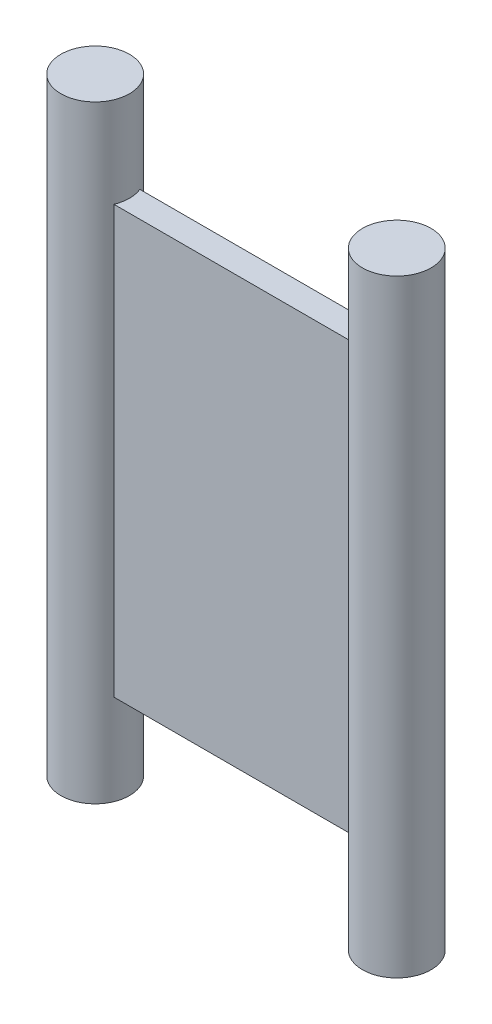
ISO-10303-21;
HEADER;
FILE_DESCRIPTION(('STEP AP214'),'2;1');
FILE_NAME('part.step','',(''),(''),'','','');
FILE_SCHEMA(('AUTOMOTIVE_DESIGN { 1 0 10303 214 1 1 1 1 }'));
ENDSEC;
DATA;
#1=APPLICATION_CONTEXT('core data for automotive mechanical design processes');
#2=APPLICATION_PROTOCOL_DEFINITION('international standard','automotive_design',2000,#1);
#3=PRODUCT_CONTEXT('',#1,'mechanical');
#4=PRODUCT('Part','Part','',(#3));
#5=PRODUCT_RELATED_PRODUCT_CATEGORY('part','',(#4));
#6=PRODUCT_DEFINITION_FORMATION('','',#4);
#7=PRODUCT_DEFINITION_CONTEXT('part definition',#1,'design');
#8=PRODUCT_DEFINITION('design','',#6,#7);
#9=PRODUCT_DEFINITION_SHAPE('','',#8);
#10=(LENGTH_UNIT() NAMED_UNIT(*) SI_UNIT(.MILLI.,.METRE.));
#11=(NAMED_UNIT(*) PLANE_ANGLE_UNIT() SI_UNIT($,.RADIAN.));
#12=(NAMED_UNIT(*) SI_UNIT($,.STERADIAN.) SOLID_ANGLE_UNIT());
#13=UNCERTAINTY_MEASURE_WITH_UNIT(LENGTH_MEASURE(1.E-05),#10,'distance_accuracy_value','');
#14=(GEOMETRIC_REPRESENTATION_CONTEXT(3) GLOBAL_UNCERTAINTY_ASSIGNED_CONTEXT((#13)) GLOBAL_UNIT_ASSIGNED_CONTEXT((#10,
#11,#12)) REPRESENTATION_CONTEXT('',''));
#15=CARTESIAN_POINT('',(0.,0.,0.));
#16=DIRECTION('',(0.,0.,1.));
#17=DIRECTION('',(1.,0.,0.));
#18=AXIS2_PLACEMENT_3D('',#15,#16,#17);
#19=CARTESIAN_POINT('',(5.83,16.5,0.499999999999999));
#20=DIRECTION('',(0.,0.,-1.));
#21=DIRECTION('',(-1.,0.,0.));
#22=AXIS2_PLACEMENT_3D('',#19,#20,#21);
#23=PLANE('',#22);
#24=DIRECTION('',(0.,-1.,0.));
#25=VECTOR('',#24,1.);
#26=CARTESIAN_POINT('',(4.6029608808192,20.,0.499999999999999));
#27=LINE('',#26,#25);
#28=CARTESIAN_POINT('',(4.6029608808192,16.5,0.499999999999999));
#29=VERTEX_POINT('',#28);
#30=CARTESIAN_POINT('',(4.6029608808192,0.,0.499999999999999));
#31=VERTEX_POINT('',#30);
#32=EDGE_CURVE('E53',#29,#31,#27,.T.);
#33=ORIENTED_EDGE('',*,*,#32,.F.);
#34=DIRECTION('',(1.,0.,0.));
#35=VECTOR('',#34,1.);
#36=CARTESIAN_POINT('',(5.83,16.5,0.499999999999999));
#37=LINE('',#36,#35);
#38=CARTESIAN_POINT('',(-4.6029608808192,16.5,0.500000000000001));
#39=VERTEX_POINT('',#38);
#40=EDGE_CURVE('E90',#39,#29,#37,.T.);
#41=ORIENTED_EDGE('',*,*,#40,.F.);
#42=DIRECTION('',(0.,-1.,0.));
#43=VECTOR('',#42,1.);
#44=CARTESIAN_POINT('',(-4.6029608808192,20.,0.500000000000001));
#45=LINE('',#44,#43);
#46=CARTESIAN_POINT('',(-4.6029608808192,0.,0.500000000000001));
#47=VERTEX_POINT('',#46);
#48=EDGE_CURVE('E103',#47,#39,#45,.F.);
#49=ORIENTED_EDGE('',*,*,#48,.F.);
#50=DIRECTION('',(1.,0.,0.));
#51=VECTOR('',#50,1.);
#52=CARTESIAN_POINT('',(5.83,0.,0.499999999999999));
#53=LINE('',#52,#51);
#54=EDGE_CURVE('E91',#47,#31,#53,.T.);
#55=ORIENTED_EDGE('',*,*,#54,.T.);
#56=EDGE_LOOP('',(#33,#41,#49,#55));
#57=FACE_BOUND('',#56,.T.);
#58=ADVANCED_FACE('F39',(#57),#23,.F.);
#59=CARTESIAN_POINT('',(5.83,16.5,-0.500000000000001));
#60=DIRECTION('',(0.,0.,1.));
#61=DIRECTION('',(1.,0.,0.));
#62=AXIS2_PLACEMENT_3D('',#59,#60,#61);
#63=PLANE('',#62);
#64=DIRECTION('',(0.,-1.,0.));
#65=VECTOR('',#64,1.);
#66=CARTESIAN_POINT('',(4.6029608808192,20.,-0.500000000000001));
#67=LINE('',#66,#65);
#68=CARTESIAN_POINT('',(4.6029608808192,0.,-0.500000000000001));
#69=VERTEX_POINT('',#68);
#70=CARTESIAN_POINT('',(4.6029608808192,16.5,-0.500000000000001));
#71=VERTEX_POINT('',#70);
#72=EDGE_CURVE('E78',#69,#71,#67,.F.);
#73=ORIENTED_EDGE('',*,*,#72,.F.);
#74=DIRECTION('',(-1.,0.,0.));
#75=VECTOR('',#74,1.);
#76=CARTESIAN_POINT('',(5.83,0.,-0.500000000000001));
#77=LINE('',#76,#75);
#78=CARTESIAN_POINT('',(-4.6029608808192,0.,-0.499999999999999));
#79=VERTEX_POINT('',#78);
#80=EDGE_CURVE('E60',#69,#79,#77,.T.);
#81=ORIENTED_EDGE('',*,*,#80,.T.);
#82=DIRECTION('',(0.,-1.,0.));
#83=VECTOR('',#82,1.);
#84=CARTESIAN_POINT('',(-4.6029608808192,20.,-0.499999999999999));
#85=LINE('',#84,#83);
#86=CARTESIAN_POINT('',(-4.6029608808192,16.5,-0.499999999999999));
#87=VERTEX_POINT('',#86);
#88=EDGE_CURVE('E105',#87,#79,#85,.T.);
#89=ORIENTED_EDGE('',*,*,#88,.F.);
#90=DIRECTION('',(-1.,0.,0.));
#91=VECTOR('',#90,1.);
#92=CARTESIAN_POINT('',(5.83,16.5,-0.500000000000001));
#93=LINE('',#92,#91);
#94=EDGE_CURVE('E85',#71,#87,#93,.T.);
#95=ORIENTED_EDGE('',*,*,#94,.F.);
#96=EDGE_LOOP('',(#73,#81,#89,#95));
#97=FACE_BOUND('',#96,.T.);
#98=ADVANCED_FACE('F84',(#97),#63,.F.);
#99=CARTESIAN_POINT('',(-5.83,20.,0.));
#100=DIRECTION('',(0.,-1.,0.));
#101=DIRECTION('',(0.,0.,-1.));
#102=AXIS2_PLACEMENT_3D('',#99,#100,#101);
#103=CYLINDRICAL_SURFACE('',#102,1.325);
#104=CARTESIAN_POINT('',(-5.83,20.,0.));
#105=DIRECTION('',(0.,1.,0.));
#106=DIRECTION('',(0.,0.,1.));
#107=AXIS2_PLACEMENT_3D('',#104,#105,#106);
#108=CIRCLE('',#107,1.325);
#109=CARTESIAN_POINT('',(-5.83,20.,1.325));
#110=VERTEX_POINT('',#109);
#111=EDGE_CURVE('E107',#110,#110,#108,.T.);
#112=ORIENTED_EDGE('',*,*,#111,.F.);
#113=EDGE_LOOP('',(#112));
#114=FACE_BOUND('',#113,.T.);
#115=CARTESIAN_POINT('',(-5.83,-3.5,0.));
#116=DIRECTION('',(0.,1.,0.));
#117=DIRECTION('',(0.,0.,1.));
#118=AXIS2_PLACEMENT_3D('',#115,#116,#117);
#119=CIRCLE('',#118,1.325);
#120=CARTESIAN_POINT('',(-5.83,-3.5,1.325));
#121=VERTEX_POINT('',#120);
#122=EDGE_CURVE('E108',#121,#121,#119,.T.);
#123=ORIENTED_EDGE('',*,*,#122,.T.);
#124=EDGE_LOOP('',(#123));
#125=FACE_BOUND('',#124,.T.);
#126=ORIENTED_EDGE('',*,*,#48,.T.);
#127=CARTESIAN_POINT('',(-5.83,16.5,0.));
#128=DIRECTION('',(0.,-1.,0.));
#129=DIRECTION('',(0.,0.,-1.));
#130=AXIS2_PLACEMENT_3D('',#127,#128,#129);
#131=CIRCLE('',#130,1.325);
#132=EDGE_CURVE('E95',#39,#87,#131,.F.);
#133=ORIENTED_EDGE('',*,*,#132,.T.);
#134=ORIENTED_EDGE('',*,*,#88,.T.);
#135=CARTESIAN_POINT('',(-5.83,0.,0.));
#136=DIRECTION('',(0.,-1.,0.));
#137=DIRECTION('',(0.,0.,-1.));
#138=AXIS2_PLACEMENT_3D('',#135,#136,#137);
#139=CIRCLE('',#138,1.325);
#140=EDGE_CURVE('E46',#47,#79,#139,.F.);
#141=ORIENTED_EDGE('',*,*,#140,.F.);
#142=EDGE_LOOP('',(#126,#133,#134,#141));
#143=FACE_BOUND('',#142,.T.);
#144=ADVANCED_FACE('F138',(#114,#125,#143),#103,.T.);
#145=CARTESIAN_POINT('',(-5.83,20.,0.));
#146=DIRECTION('',(0.,1.,0.));
#147=DIRECTION('',(0.,0.,1.));
#148=AXIS2_PLACEMENT_3D('',#145,#146,#147);
#149=PLANE('',#148);
#150=ORIENTED_EDGE('',*,*,#111,.T.);
#151=EDGE_LOOP('',(#150));
#152=FACE_BOUND('',#151,.T.);
#153=ADVANCED_FACE('F144',(#152),#149,.T.);
#154=CARTESIAN_POINT('',(-5.83,-3.5,0.));
#155=DIRECTION('',(0.,1.,0.));
#156=DIRECTION('',(0.,0.,1.));
#157=AXIS2_PLACEMENT_3D('',#154,#155,#156);
#158=PLANE('',#157);
#159=ORIENTED_EDGE('',*,*,#122,.F.);
#160=EDGE_LOOP('',(#159));
#161=FACE_BOUND('',#160,.T.);
#162=ADVANCED_FACE('F150',(#161),#158,.F.);
#163=CARTESIAN_POINT('',(0.,16.5,0.));
#164=DIRECTION('',(0.,-1.,0.));
#165=DIRECTION('',(0.,0.,-1.));
#166=AXIS2_PLACEMENT_3D('',#163,#164,#165);
#167=PLANE('',#166);
#168=CARTESIAN_POINT('',(5.83,16.5,0.));
#169=DIRECTION('',(0.,-1.,0.));
#170=DIRECTION('',(0.,0.,-1.));
#171=AXIS2_PLACEMENT_3D('',#168,#169,#170);
#172=CIRCLE('',#171,1.325);
#173=EDGE_CURVE('E111',#71,#29,#172,.F.);
#174=ORIENTED_EDGE('',*,*,#173,.F.);
#175=ORIENTED_EDGE('',*,*,#94,.T.);
#176=ORIENTED_EDGE('',*,*,#132,.F.);
#177=ORIENTED_EDGE('',*,*,#40,.T.);
#178=EDGE_LOOP('',(#174,#175,#176,#177));
#179=FACE_BOUND('',#178,.T.);
#180=ADVANCED_FACE('F141',(#179),#167,.F.);
#181=CARTESIAN_POINT('',(0.,0.,0.));
#182=DIRECTION('',(0.,-1.,0.));
#183=DIRECTION('',(0.,0.,-1.));
#184=AXIS2_PLACEMENT_3D('',#181,#182,#183);
#185=PLANE('',#184);
#186=ORIENTED_EDGE('',*,*,#80,.F.);
#187=CARTESIAN_POINT('',(5.83,0.,0.));
#188=DIRECTION('',(0.,-1.,0.));
#189=DIRECTION('',(0.,0.,-1.));
#190=AXIS2_PLACEMENT_3D('',#187,#188,#189);
#191=CIRCLE('',#190,1.325);
#192=EDGE_CURVE('E11',#69,#31,#191,.F.);
#193=ORIENTED_EDGE('',*,*,#192,.T.);
#194=ORIENTED_EDGE('',*,*,#54,.F.);
#195=ORIENTED_EDGE('',*,*,#140,.T.);
#196=EDGE_LOOP('',(#186,#193,#194,#195));
#197=FACE_BOUND('',#196,.T.);
#198=ADVANCED_FACE('F89',(#197),#185,.T.);
#199=CARTESIAN_POINT('',(5.83,20.,0.));
#200=DIRECTION('',(0.,-1.,0.));
#201=DIRECTION('',(0.,0.,-1.));
#202=AXIS2_PLACEMENT_3D('',#199,#200,#201);
#203=CYLINDRICAL_SURFACE('',#202,1.325);
#204=CARTESIAN_POINT('',(5.83,20.,0.));
#205=DIRECTION('',(0.,1.,0.));
#206=DIRECTION('',(0.,0.,1.));
#207=AXIS2_PLACEMENT_3D('',#204,#205,#206);
#208=CIRCLE('',#207,1.325);
#209=CARTESIAN_POINT('',(5.83,20.,1.325));
#210=VERTEX_POINT('',#209);
#211=EDGE_CURVE('E116',#210,#210,#208,.T.);
#212=ORIENTED_EDGE('',*,*,#211,.F.);
#213=EDGE_LOOP('',(#212));
#214=FACE_BOUND('',#213,.T.);
#215=CARTESIAN_POINT('',(5.83,-3.5,0.));
#216=DIRECTION('',(0.,1.,0.));
#217=DIRECTION('',(0.,0.,1.));
#218=AXIS2_PLACEMENT_3D('',#215,#216,#217);
#219=CIRCLE('',#218,1.325);
#220=CARTESIAN_POINT('',(5.83,-3.5,1.325));
#221=VERTEX_POINT('',#220);
#222=EDGE_CURVE('E86',#221,#221,#219,.T.);
#223=ORIENTED_EDGE('',*,*,#222,.T.);
#224=EDGE_LOOP('',(#223));
#225=FACE_BOUND('',#224,.T.);
#226=ORIENTED_EDGE('',*,*,#72,.T.);
#227=ORIENTED_EDGE('',*,*,#173,.T.);
#228=ORIENTED_EDGE('',*,*,#32,.T.);
#229=ORIENTED_EDGE('',*,*,#192,.F.);
#230=EDGE_LOOP('',(#226,#227,#228,#229));
#231=FACE_BOUND('',#230,.T.);
#232=ADVANCED_FACE('F77',(#214,#225,#231),#203,.T.);
#233=CARTESIAN_POINT('',(5.83,20.,0.));
#234=DIRECTION('',(0.,1.,0.));
#235=DIRECTION('',(0.,0.,1.));
#236=AXIS2_PLACEMENT_3D('',#233,#234,#235);
#237=PLANE('',#236);
#238=ORIENTED_EDGE('',*,*,#211,.T.);
#239=EDGE_LOOP('',(#238));
#240=FACE_BOUND('',#239,.T.);
#241=ADVANCED_FACE('F125',(#240),#237,.T.);
#242=CARTESIAN_POINT('',(5.83,-3.5,0.));
#243=DIRECTION('',(0.,1.,0.));
#244=DIRECTION('',(0.,0.,1.));
#245=AXIS2_PLACEMENT_3D('',#242,#243,#244);
#246=PLANE('',#245);
#247=ORIENTED_EDGE('',*,*,#222,.F.);
#248=EDGE_LOOP('',(#247));
#249=FACE_BOUND('',#248,.T.);
#250=ADVANCED_FACE('F123',(#249),#246,.F.);
#251=CLOSED_SHELL('',(#58,#98,#144,#153,#162,#180,#198,#232,#241,#250));
#252=MANIFOLD_SOLID_BREP('B2',#251);
#253=ADVANCED_BREP_SHAPE_REPRESENTATION('',(#18,#252),#14);
#254=SHAPE_DEFINITION_REPRESENTATION(#9,#253);
ENDSEC;
END-ISO-10303-21;
